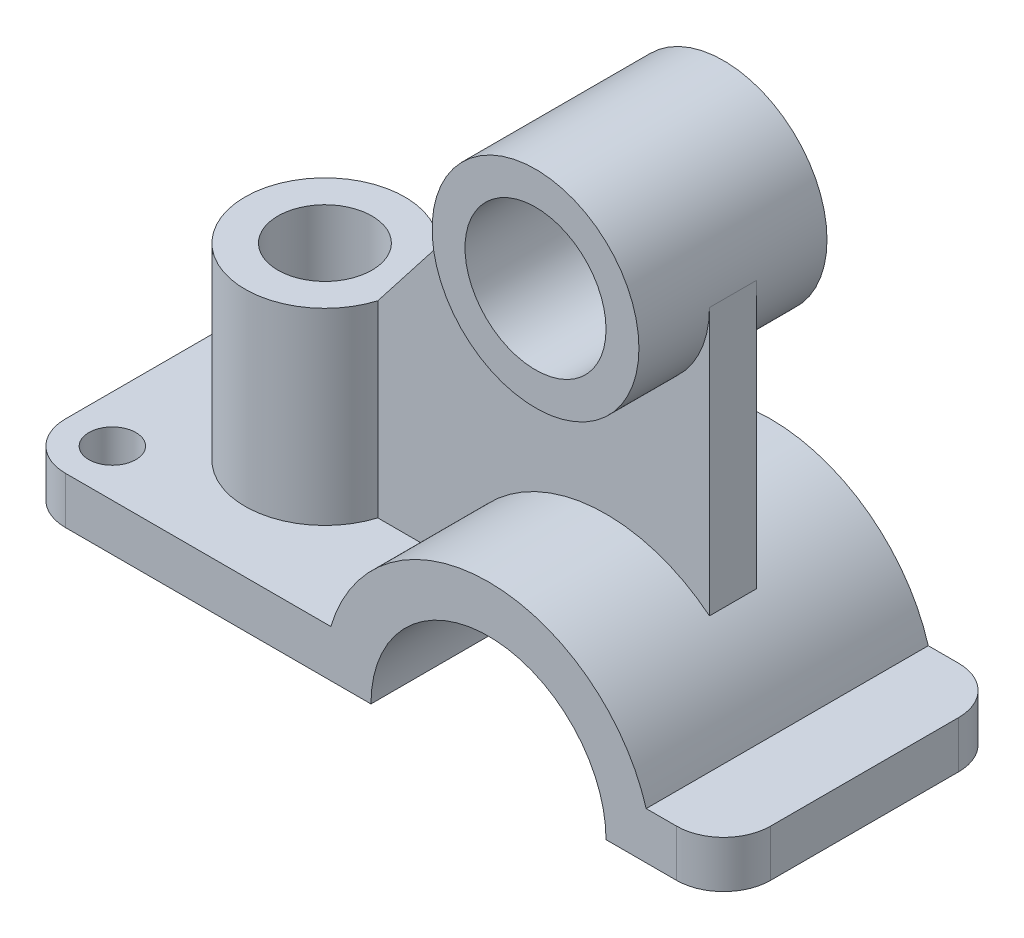
ISO-10303-21;
HEADER;
FILE_DESCRIPTION(('STEP AP214'),'2;1');
FILE_NAME('part.step','',(''),(''),'','','');
FILE_SCHEMA(('AUTOMOTIVE_DESIGN { 1 0 10303 214 1 1 1 1 }'));
ENDSEC;
DATA;
#1=APPLICATION_CONTEXT('core data for automotive mechanical design processes');
#2=APPLICATION_PROTOCOL_DEFINITION('international standard','automotive_design',2000,#1);
#3=PRODUCT_CONTEXT('',#1,'mechanical');
#4=PRODUCT('Part','Part','',(#3));
#5=PRODUCT_RELATED_PRODUCT_CATEGORY('part','',(#4));
#6=PRODUCT_DEFINITION_FORMATION('','',#4);
#7=PRODUCT_DEFINITION_CONTEXT('part definition',#1,'design');
#8=PRODUCT_DEFINITION('design','',#6,#7);
#9=PRODUCT_DEFINITION_SHAPE('','',#8);
#10=(LENGTH_UNIT() NAMED_UNIT(*) SI_UNIT(.MILLI.,.METRE.));
#11=(NAMED_UNIT(*) PLANE_ANGLE_UNIT() SI_UNIT($,.RADIAN.));
#12=(NAMED_UNIT(*) SI_UNIT($,.STERADIAN.) SOLID_ANGLE_UNIT());
#13=UNCERTAINTY_MEASURE_WITH_UNIT(LENGTH_MEASURE(1.E-05),#10,'distance_accuracy_value','');
#14=(GEOMETRIC_REPRESENTATION_CONTEXT(3) GLOBAL_UNCERTAINTY_ASSIGNED_CONTEXT((#13)) GLOBAL_UNIT_ASSIGNED_CONTEXT((#10,
#11,#12)) REPRESENTATION_CONTEXT('',''));
#15=CARTESIAN_POINT('',(0.,0.,0.));
#16=DIRECTION('',(0.,0.,1.));
#17=DIRECTION('',(1.,0.,0.));
#18=AXIS2_PLACEMENT_3D('',#15,#16,#17);
#19=CARTESIAN_POINT('',(0.,168.052354843376,40.));
#20=DIRECTION('',(0.,0.,-1.));
#21=DIRECTION('',(-1.,0.,0.));
#22=AXIS2_PLACEMENT_3D('',#19,#20,#21);
#23=CYLINDRICAL_SURFACE('',#22,30.);
#24=CARTESIAN_POINT('',(0.,168.052354843376,40.));
#25=DIRECTION('',(0.,0.,1.));
#26=DIRECTION('',(1.,0.,0.));
#27=AXIS2_PLACEMENT_3D('',#24,#25,#26);
#28=CIRCLE('',#27,30.);
#29=CARTESIAN_POINT('',(30.,168.052354843376,40.));
#30=VERTEX_POINT('',#29);
#31=EDGE_CURVE('E83',#30,#30,#28,.T.);
#32=ORIENTED_EDGE('',*,*,#31,.T.);
#33=EDGE_LOOP('',(#32));
#34=FACE_BOUND('',#33,.T.);
#35=CARTESIAN_POINT('',(0.,168.052354843376,-40.));
#36=DIRECTION('',(0.,0.,1.));
#37=DIRECTION('',(1.,0.,0.));
#38=AXIS2_PLACEMENT_3D('',#35,#36,#37);
#39=CIRCLE('',#38,30.);
#40=CARTESIAN_POINT('',(30.,168.052354843376,-40.));
#41=VERTEX_POINT('',#40);
#42=EDGE_CURVE('E262',#41,#41,#39,.T.);
#43=ORIENTED_EDGE('',*,*,#42,.F.);
#44=EDGE_LOOP('',(#43));
#45=FACE_BOUND('',#44,.T.);
#46=ADVANCED_FACE('F74',(#34,#45),#23,.F.);
#47=CARTESIAN_POINT('',(0.,168.052354843376,40.));
#48=DIRECTION('',(0.,0.,-1.));
#49=DIRECTION('',(-1.,0.,0.));
#50=AXIS2_PLACEMENT_3D('',#47,#48,#49);
#51=CYLINDRICAL_SURFACE('',#50,44.);
#52=DIRECTION('',(0.,0.,-1.));
#53=VECTOR('',#52,1.);
#54=CARTESIAN_POINT('',(-44.,168.052354843376,9.99999999999999));
#55=LINE('',#54,#53);
#56=CARTESIAN_POINT('',(-44.,168.052354843376,9.99999999999999));
#57=VERTEX_POINT('',#56);
#58=CARTESIAN_POINT('',(-44.,168.052354843376,-9.99999999999999));
#59=VERTEX_POINT('',#58);
#60=EDGE_CURVE('E91',#57,#59,#55,.T.);
#61=ORIENTED_EDGE('',*,*,#60,.F.);
#62=CARTESIAN_POINT('',(0.,168.052354843376,9.99999999999999));
#63=DIRECTION('',(0.,0.,1.));
#64=DIRECTION('',(1.,0.,0.));
#65=AXIS2_PLACEMENT_3D('',#62,#63,#64);
#66=CIRCLE('',#65,44.);
#67=CARTESIAN_POINT('',(44.,168.052354843376,9.99999999999999));
#68=VERTEX_POINT('',#67);
#69=EDGE_CURVE('E95',#57,#68,#66,.T.);
#70=ORIENTED_EDGE('',*,*,#69,.T.);
#71=DIRECTION('',(0.,0.,-1.));
#72=VECTOR('',#71,1.);
#73=CARTESIAN_POINT('',(44.,168.052354843376,9.99999999999999));
#74=LINE('',#73,#72);
#75=CARTESIAN_POINT('',(44.,168.052354843376,-9.99999999999999));
#76=VERTEX_POINT('',#75);
#77=EDGE_CURVE('E241',#68,#76,#74,.T.);
#78=ORIENTED_EDGE('',*,*,#77,.T.);
#79=CARTESIAN_POINT('',(0.,168.052354843376,-9.99999999999999));
#80=DIRECTION('',(0.,0.,1.));
#81=DIRECTION('',(1.,0.,0.));
#82=AXIS2_PLACEMENT_3D('',#79,#80,#81);
#83=CIRCLE('',#82,44.);
#84=EDGE_CURVE('E242',#59,#76,#83,.T.);
#85=ORIENTED_EDGE('',*,*,#84,.F.);
#86=EDGE_LOOP('',(#61,#70,#78,#85));
#87=FACE_BOUND('',#86,.T.);
#88=CARTESIAN_POINT('',(0.,168.052354843376,40.));
#89=DIRECTION('',(0.,0.,1.));
#90=DIRECTION('',(1.,0.,0.));
#91=AXIS2_PLACEMENT_3D('',#88,#89,#90);
#92=CIRCLE('',#91,44.);
#93=CARTESIAN_POINT('',(44.,168.052354843376,40.));
#94=VERTEX_POINT('',#93);
#95=EDGE_CURVE('E13',#94,#94,#92,.T.);
#96=ORIENTED_EDGE('',*,*,#95,.F.);
#97=EDGE_LOOP('',(#96));
#98=FACE_BOUND('',#97,.T.);
#99=CARTESIAN_POINT('',(0.,168.052354843376,-40.));
#100=DIRECTION('',(0.,0.,1.));
#101=DIRECTION('',(1.,0.,0.));
#102=AXIS2_PLACEMENT_3D('',#99,#100,#101);
#103=CIRCLE('',#102,44.);
#104=CARTESIAN_POINT('',(44.,168.052354843376,-40.));
#105=VERTEX_POINT('',#104);
#106=EDGE_CURVE('E77',#105,#105,#103,.T.);
#107=ORIENTED_EDGE('',*,*,#106,.T.);
#108=EDGE_LOOP('',(#107));
#109=FACE_BOUND('',#108,.T.);
#110=ADVANCED_FACE('F271',(#87,#98,#109),#51,.T.);
#111=CARTESIAN_POINT('',(0.,0.,40.));
#112=DIRECTION('',(0.,0.,1.));
#113=DIRECTION('',(1.,0.,0.));
#114=AXIS2_PLACEMENT_3D('',#111,#112,#113);
#115=PLANE('',#114);
#116=ORIENTED_EDGE('',*,*,#31,.F.);
#117=EDGE_LOOP('',(#116));
#118=FACE_BOUND('',#117,.T.);
#119=ORIENTED_EDGE('',*,*,#95,.T.);
#120=EDGE_LOOP('',(#119));
#121=FACE_BOUND('',#120,.T.);
#122=ADVANCED_FACE('F275',(#118,#121),#115,.T.);
#123=CARTESIAN_POINT('',(0.,0.,-40.));
#124=DIRECTION('',(0.,0.,1.));
#125=DIRECTION('',(1.,0.,0.));
#126=AXIS2_PLACEMENT_3D('',#123,#124,#125);
#127=PLANE('',#126);
#128=ORIENTED_EDGE('',*,*,#42,.T.);
#129=EDGE_LOOP('',(#128));
#130=FACE_BOUND('',#129,.T.);
#131=ORIENTED_EDGE('',*,*,#106,.F.);
#132=EDGE_LOOP('',(#131));
#133=FACE_BOUND('',#132,.T.);
#134=ADVANCED_FACE('F273',(#130,#133),#127,.F.);
#135=CARTESIAN_POINT('',(-108.854019923227,84.9080590898827,9.99999999999999));
#136=DIRECTION('',(-0.788495548895208,0.61504046157342,0.));
#137=DIRECTION('',(-0.61504046157342,-0.788495548895208,0.));
#138=AXIS2_PLACEMENT_3D('',#135,#136,#137);
#139=PLANE('',#138);
#140=DIRECTION('',(0.61504046157342,0.788495548895208,0.));
#141=VECTOR('',#140,1.);
#142=CARTESIAN_POINT('',(-108.854019923227,84.9080590898827,-9.99999999999999));
#143=LINE('',#142,#141);
#144=CARTESIAN_POINT('',(-97.082039325,99.9999999999763,-9.99999999999999));
#145=VERTEX_POINT('',#144);
#146=EDGE_CURVE('E223',#145,#59,#143,.T.);
#147=ORIENTED_EDGE('',*,*,#146,.F.);
#148=DIRECTION('',(0.,0.,-1.));
#149=VECTOR('',#148,1.);
#150=CARTESIAN_POINT('',(-97.082039325,99.9999999999763,9.99999999999999));
#151=LINE('',#150,#149);
#152=CARTESIAN_POINT('',(-97.082039325,100.,9.99999999999999));
#153=VERTEX_POINT('',#152);
#154=EDGE_CURVE('E202',#153,#145,#151,.T.);
#155=ORIENTED_EDGE('',*,*,#154,.F.);
#156=DIRECTION('',(0.61504046157342,0.788495548895208,0.));
#157=VECTOR('',#156,1.);
#158=CARTESIAN_POINT('',(-108.854019923227,84.9080590898827,9.99999999999999));
#159=LINE('',#158,#157);
#160=EDGE_CURVE('E217',#153,#57,#159,.T.);
#161=ORIENTED_EDGE('',*,*,#160,.T.);
#162=ORIENTED_EDGE('',*,*,#60,.T.);
#163=EDGE_LOOP('',(#147,#155,#161,#162));
#164=FACE_BOUND('',#163,.T.);
#165=ADVANCED_FACE('F221',(#164),#139,.T.);
#166=CARTESIAN_POINT('',(44.,0.,9.99999999999999));
#167=DIRECTION('',(1.,0.,0.));
#168=DIRECTION('',(0.,0.,-1.));
#169=AXIS2_PLACEMENT_3D('',#166,#167,#168);
#170=PLANE('',#169);
#171=DIRECTION('',(0.,-1.,0.));
#172=VECTOR('',#171,1.);
#173=CARTESIAN_POINT('',(44.,0.,-9.99999999999999));
#174=LINE('',#173,#172);
#175=CARTESIAN_POINT('',(44.,54.4426303552649,-9.99999999999999));
#176=VERTEX_POINT('',#175);
#177=EDGE_CURVE('E231',#76,#176,#174,.T.);
#178=ORIENTED_EDGE('',*,*,#177,.F.);
#179=ORIENTED_EDGE('',*,*,#77,.F.);
#180=DIRECTION('',(0.,-1.,0.));
#181=VECTOR('',#180,1.);
#182=CARTESIAN_POINT('',(44.,0.,9.99999999999999));
#183=LINE('',#182,#181);
#184=CARTESIAN_POINT('',(44.,54.4426303552649,9.99999999999999));
#185=VERTEX_POINT('',#184);
#186=EDGE_CURVE('E238',#68,#185,#183,.T.);
#187=ORIENTED_EDGE('',*,*,#186,.T.);
#188=DIRECTION('',(0.,0.,-1.));
#189=VECTOR('',#188,1.);
#190=CARTESIAN_POINT('',(44.,54.4426303553763,9.99999999999999));
#191=LINE('',#190,#189);
#192=EDGE_CURVE('E225',#185,#176,#191,.T.);
#193=ORIENTED_EDGE('',*,*,#192,.T.);
#194=EDGE_LOOP('',(#178,#179,#187,#193));
#195=FACE_BOUND('',#194,.T.);
#196=ADVANCED_FACE('F281',(#195),#170,.T.);
#197=CARTESIAN_POINT('',(0.,0.,9.99999999999999));
#198=DIRECTION('',(0.,0.,1.));
#199=DIRECTION('',(1.,0.,0.));
#200=AXIS2_PLACEMENT_3D('',#197,#198,#199);
#201=PLANE('',#200);
#202=ORIENTED_EDGE('',*,*,#69,.F.);
#203=ORIENTED_EDGE('',*,*,#160,.F.);
#204=DIRECTION('',(0.,1.,0.));
#205=VECTOR('',#204,1.);
#206=CARTESIAN_POINT('',(-97.082039325,0.,9.99999999999999));
#207=LINE('',#206,#205);
#208=CARTESIAN_POINT('',(-97.082039325,19.9999999999763,9.99999999999999));
#209=VERTEX_POINT('',#208);
#210=EDGE_CURVE('E211',#209,#153,#207,.T.);
#211=ORIENTED_EDGE('',*,*,#210,.F.);
#212=DIRECTION('',(-1.,0.,0.));
#213=VECTOR('',#212,1.);
#214=CARTESIAN_POINT('',(0.,19.9999999999763,9.99999999999999));
#215=LINE('',#214,#213);
#216=CARTESIAN_POINT('',(-67.0820393250008,19.9999999999763,9.99999999999999));
#217=VERTEX_POINT('',#216);
#218=EDGE_CURVE('E216',#217,#209,#215,.T.);
#219=ORIENTED_EDGE('',*,*,#218,.F.);
#220=CARTESIAN_POINT('',(0.,0.,9.99999999999999));
#221=DIRECTION('',(0.,0.,1.));
#222=DIRECTION('',(1.,0.,0.));
#223=AXIS2_PLACEMENT_3D('',#220,#221,#222);
#224=CIRCLE('',#223,70.0000000000001);
#225=EDGE_CURVE('E236',#185,#217,#224,.T.);
#226=ORIENTED_EDGE('',*,*,#225,.F.);
#227=ORIENTED_EDGE('',*,*,#186,.F.);
#228=EDGE_LOOP('',(#202,#203,#211,#219,#226,#227));
#229=FACE_BOUND('',#228,.T.);
#230=ADVANCED_FACE('F227',(#229),#201,.T.);
#231=CARTESIAN_POINT('',(0.,0.,-9.99999999999999));
#232=DIRECTION('',(0.,0.,1.));
#233=DIRECTION('',(1.,0.,0.));
#234=AXIS2_PLACEMENT_3D('',#231,#232,#233);
#235=PLANE('',#234);
#236=ORIENTED_EDGE('',*,*,#84,.T.);
#237=ORIENTED_EDGE('',*,*,#177,.T.);
#238=CARTESIAN_POINT('',(0.,0.,-9.99999999999999));
#239=DIRECTION('',(0.,0.,1.));
#240=DIRECTION('',(1.,0.,0.));
#241=AXIS2_PLACEMENT_3D('',#238,#239,#240);
#242=CIRCLE('',#241,70.0000000000001);
#243=CARTESIAN_POINT('',(-67.0820393250008,19.9999999999763,-9.99999999999999));
#244=VERTEX_POINT('',#243);
#245=EDGE_CURVE('E253',#176,#244,#242,.T.);
#246=ORIENTED_EDGE('',*,*,#245,.T.);
#247=DIRECTION('',(-1.,0.,0.));
#248=VECTOR('',#247,1.);
#249=CARTESIAN_POINT('',(0.,19.9999999999763,-9.99999999999999));
#250=LINE('',#249,#248);
#251=CARTESIAN_POINT('',(-97.082039325,19.9999999999763,-10.));
#252=VERTEX_POINT('',#251);
#253=EDGE_CURVE('E250',#244,#252,#250,.T.);
#254=ORIENTED_EDGE('',*,*,#253,.T.);
#255=DIRECTION('',(0.,1.,0.));
#256=VECTOR('',#255,1.);
#257=CARTESIAN_POINT('',(-97.082039325,0.,-9.99999999999999));
#258=LINE('',#257,#256);
#259=EDGE_CURVE('E248',#252,#145,#258,.T.);
#260=ORIENTED_EDGE('',*,*,#259,.T.);
#261=ORIENTED_EDGE('',*,*,#146,.T.);
#262=EDGE_LOOP('',(#236,#237,#246,#254,#260,#261));
#263=FACE_BOUND('',#262,.T.);
#264=ADVANCED_FACE('F304',(#263),#235,.F.);
#265=CARTESIAN_POINT('',(100.,0.,60.));
#266=DIRECTION('',(1.,0.,0.));
#267=DIRECTION('',(0.,0.,-1.));
#268=AXIS2_PLACEMENT_3D('',#265,#266,#267);
#269=PLANE('',#268);
#270=DIRECTION('',(0.,-1.,0.));
#271=VECTOR('',#270,1.);
#272=CARTESIAN_POINT('',(100.,120.,40.));
#273=LINE('',#272,#271);
#274=CARTESIAN_POINT('',(100.,19.9999999999763,40.));
#275=VERTEX_POINT('',#274);
#276=CARTESIAN_POINT('',(100.,0.,40.));
#277=VERTEX_POINT('',#276);
#278=EDGE_CURVE('E557',#275,#277,#273,.T.);
#279=ORIENTED_EDGE('',*,*,#278,.T.);
#280=DIRECTION('',(0.,0.,-1.));
#281=VECTOR('',#280,1.);
#282=CARTESIAN_POINT('',(100.,0.,60.));
#283=LINE('',#282,#281);
#284=CARTESIAN_POINT('',(100.,0.,-40.));
#285=VERTEX_POINT('',#284);
#286=EDGE_CURVE('E637',#277,#285,#283,.T.);
#287=ORIENTED_EDGE('',*,*,#286,.T.);
#288=DIRECTION('',(0.,-1.,0.));
#289=VECTOR('',#288,1.);
#290=CARTESIAN_POINT('',(100.,120.,-40.));
#291=LINE('',#290,#289);
#292=CARTESIAN_POINT('',(100.,19.9999999999763,-40.));
#293=VERTEX_POINT('',#292);
#294=EDGE_CURVE('E555',#293,#285,#291,.T.);
#295=ORIENTED_EDGE('',*,*,#294,.F.);
#296=DIRECTION('',(0.,0.,-1.));
#297=VECTOR('',#296,1.);
#298=CARTESIAN_POINT('',(100.,19.9999999999763,60.));
#299=LINE('',#298,#297);
#300=EDGE_CURVE('E634',#275,#293,#299,.T.);
#301=ORIENTED_EDGE('',*,*,#300,.F.);
#302=EDGE_LOOP('',(#279,#287,#295,#301));
#303=FACE_BOUND('',#302,.T.);
#304=ADVANCED_FACE('F308',(#303),#269,.T.);
#305=CARTESIAN_POINT('',(0.,19.9999999999763,60.));
#306=DIRECTION('',(0.,-1.,0.));
#307=DIRECTION('',(0.,0.,-1.));
#308=AXIS2_PLACEMENT_3D('',#305,#306,#307);
#309=PLANE('',#308);
#310=ORIENTED_EDGE('',*,*,#218,.T.);
#311=CARTESIAN_POINT('',(-129.5781929436,19.9999999999763,0.));
#312=DIRECTION('',(0.,-1.,0.));
#313=DIRECTION('',(0.,0.,-1.));
#314=AXIS2_PLACEMENT_3D('',#311,#312,#313);
#315=CIRCLE('',#314,34.0000000000537);
#316=EDGE_CURVE('E206',#252,#209,#315,.F.);
#317=ORIENTED_EDGE('',*,*,#316,.F.);
#318=ORIENTED_EDGE('',*,*,#253,.F.);
#319=DIRECTION('',(0.,0.,-1.));
#320=VECTOR('',#319,1.);
#321=CARTESIAN_POINT('',(-67.0820393250008,19.9999999999763,60.));
#322=LINE('',#321,#320);
#323=CARTESIAN_POINT('',(-67.0820393250008,19.9999999999763,-60.));
#324=VERTEX_POINT('',#323);
#325=EDGE_CURVE('E628',#244,#324,#322,.T.);
#326=ORIENTED_EDGE('',*,*,#325,.T.);
#327=DIRECTION('',(-1.,0.,0.));
#328=VECTOR('',#327,1.);
#329=CARTESIAN_POINT('',(0.,19.9999999999763,-60.));
#330=LINE('',#329,#328);
#331=CARTESIAN_POINT('',(-180.,19.9999999999763,-60.));
#332=VERTEX_POINT('',#331);
#333=EDGE_CURVE('E616',#324,#332,#330,.T.);
#334=ORIENTED_EDGE('',*,*,#333,.T.);
#335=CARTESIAN_POINT('',(-180.,19.9999999999763,-40.));
#336=DIRECTION('',(0.,-1.,0.));
#337=DIRECTION('',(0.,0.,-1.));
#338=AXIS2_PLACEMENT_3D('',#335,#336,#337);
#339=CIRCLE('',#338,20.);
#340=CARTESIAN_POINT('',(-200.,19.9999999999763,-40.));
#341=VERTEX_POINT('',#340);
#342=EDGE_CURVE('E560',#332,#341,#339,.F.);
#343=ORIENTED_EDGE('',*,*,#342,.T.);
#344=DIRECTION('',(0.,0.,-1.));
#345=VECTOR('',#344,1.);
#346=CARTESIAN_POINT('',(-200.,19.9999999999763,60.));
#347=LINE('',#346,#345);
#348=CARTESIAN_POINT('',(-200.,19.9999999999763,40.));
#349=VERTEX_POINT('',#348);
#350=EDGE_CURVE('E625',#349,#341,#347,.T.);
#351=ORIENTED_EDGE('',*,*,#350,.F.);
#352=CARTESIAN_POINT('',(-180.,19.9999999999763,40.));
#353=DIRECTION('',(0.,-1.,0.));
#354=DIRECTION('',(0.,0.,-1.));
#355=AXIS2_PLACEMENT_3D('',#352,#353,#354);
#356=CIRCLE('',#355,20.);
#357=CARTESIAN_POINT('',(-180.,19.9999999999763,60.));
#358=VERTEX_POINT('',#357);
#359=EDGE_CURVE('E565',#349,#358,#356,.F.);
#360=ORIENTED_EDGE('',*,*,#359,.T.);
#361=DIRECTION('',(-1.,0.,0.));
#362=VECTOR('',#361,1.);
#363=CARTESIAN_POINT('',(0.,19.9999999999763,60.));
#364=LINE('',#363,#362);
#365=CARTESIAN_POINT('',(-67.0820393250008,19.9999999999763,60.));
#366=VERTEX_POINT('',#365);
#367=EDGE_CURVE('E598',#366,#358,#364,.T.);
#368=ORIENTED_EDGE('',*,*,#367,.F.);
#369=EDGE_CURVE('E629',#366,#217,#322,.T.);
#370=ORIENTED_EDGE('',*,*,#369,.T.);
#371=EDGE_LOOP('',(#310,#317,#318,#326,#334,#343,#351,#360,#368,#370));
#372=FACE_BOUND('',#371,.T.);
#373=CARTESIAN_POINT('',(-180.,19.9999999999763,-40.));
#374=DIRECTION('',(0.,-1.,0.));
#375=DIRECTION('',(0.,0.,-1.));
#376=AXIS2_PLACEMENT_3D('',#373,#374,#375);
#377=CIRCLE('',#376,10.);
#378=CARTESIAN_POINT('',(-180.,19.9999999999763,-50.));
#379=VERTEX_POINT('',#378);
#380=EDGE_CURVE('E574',#379,#379,#377,.F.);
#381=ORIENTED_EDGE('',*,*,#380,.F.);
#382=EDGE_LOOP('',(#381));
#383=FACE_BOUND('',#382,.T.);
#384=CARTESIAN_POINT('',(-180.,19.9999999999763,40.));
#385=DIRECTION('',(0.,-1.,0.));
#386=DIRECTION('',(0.,0.,-1.));
#387=AXIS2_PLACEMENT_3D('',#384,#385,#386);
#388=CIRCLE('',#387,9.99999999999998);
#389=CARTESIAN_POINT('',(-180.,19.9999999999763,30.));
#390=VERTEX_POINT('',#389);
#391=EDGE_CURVE('E582',#390,#390,#388,.F.);
#392=ORIENTED_EDGE('',*,*,#391,.F.);
#393=EDGE_LOOP('',(#392));
#394=FACE_BOUND('',#393,.T.);
#395=ADVANCED_FACE('F351',(#372,#383,#394),#309,.F.);
#396=CARTESIAN_POINT('',(-200.,0.,60.));
#397=DIRECTION('',(-1.,0.,0.));
#398=DIRECTION('',(0.,0.,1.));
#399=AXIS2_PLACEMENT_3D('',#396,#397,#398);
#400=PLANE('',#399);
#401=DIRECTION('',(0.,-1.,0.));
#402=VECTOR('',#401,1.);
#403=CARTESIAN_POINT('',(-200.,120.,-40.));
#404=LINE('',#403,#402);
#405=CARTESIAN_POINT('',(-200.,0.,-40.));
#406=VERTEX_POINT('',#405);
#407=EDGE_CURVE('E552',#341,#406,#404,.T.);
#408=ORIENTED_EDGE('',*,*,#407,.T.);
#409=DIRECTION('',(0.,0.,-1.));
#410=VECTOR('',#409,1.);
#411=CARTESIAN_POINT('',(-200.,-2.36477504245158E-11,60.));
#412=LINE('',#411,#410);
#413=CARTESIAN_POINT('',(-200.,0.,40.));
#414=VERTEX_POINT('',#413);
#415=EDGE_CURVE('E622',#414,#406,#412,.T.);
#416=ORIENTED_EDGE('',*,*,#415,.F.);
#417=DIRECTION('',(0.,-1.,0.));
#418=VECTOR('',#417,1.);
#419=CARTESIAN_POINT('',(-200.,120.,40.));
#420=LINE('',#419,#418);
#421=EDGE_CURVE('E550',#349,#414,#420,.T.);
#422=ORIENTED_EDGE('',*,*,#421,.F.);
#423=ORIENTED_EDGE('',*,*,#350,.T.);
#424=EDGE_LOOP('',(#408,#416,#422,#423));
#425=FACE_BOUND('',#424,.T.);
#426=ADVANCED_FACE('F360',(#425),#400,.T.);
#427=CARTESIAN_POINT('',(0.,-2.36477504245158E-11,60.));
#428=DIRECTION('',(0.,-1.,0.));
#429=DIRECTION('',(0.,0.,-1.));
#430=AXIS2_PLACEMENT_3D('',#427,#428,#429);
#431=PLANE('',#430);
#432=CARTESIAN_POINT('',(-180.,0.,-40.));
#433=DIRECTION('',(0.,1.,0.));
#434=DIRECTION('',(0.,0.,1.));
#435=AXIS2_PLACEMENT_3D('',#432,#433,#434);
#436=CIRCLE('',#435,10.);
#437=CARTESIAN_POINT('',(-180.,0.,-30.));
#438=VERTEX_POINT('',#437);
#439=EDGE_CURVE('E571',#438,#438,#436,.T.);
#440=ORIENTED_EDGE('',*,*,#439,.T.);
#441=EDGE_LOOP('',(#440));
#442=FACE_BOUND('',#441,.T.);
#443=CARTESIAN_POINT('',(-180.,0.,40.));
#444=DIRECTION('',(0.,1.,0.));
#445=DIRECTION('',(0.,0.,1.));
#446=AXIS2_PLACEMENT_3D('',#443,#444,#445);
#447=CIRCLE('',#446,9.99999999999998);
#448=CARTESIAN_POINT('',(-180.,0.,50.));
#449=VERTEX_POINT('',#448);
#450=EDGE_CURVE('E579',#449,#449,#447,.T.);
#451=ORIENTED_EDGE('',*,*,#450,.T.);
#452=EDGE_LOOP('',(#451));
#453=FACE_BOUND('',#452,.T.);
#454=CARTESIAN_POINT('',(-180.,0.,-40.));
#455=DIRECTION('',(0.,1.,0.));
#456=DIRECTION('',(0.,0.,1.));
#457=AXIS2_PLACEMENT_3D('',#454,#455,#456);
#458=CIRCLE('',#457,20.);
#459=CARTESIAN_POINT('',(-180.,0.,-60.));
#460=VERTEX_POINT('',#459);
#461=EDGE_CURVE('E546',#460,#406,#458,.T.);
#462=ORIENTED_EDGE('',*,*,#461,.F.);
#463=DIRECTION('',(-1.,0.,0.));
#464=VECTOR('',#463,1.);
#465=CARTESIAN_POINT('',(0.,-2.36477504245158E-11,-60.));
#466=LINE('',#465,#464);
#467=CARTESIAN_POINT('',(-50.,-2.36477504245158E-11,-60.));
#468=VERTEX_POINT('',#467);
#469=EDGE_CURVE('E590',#468,#460,#466,.T.);
#470=ORIENTED_EDGE('',*,*,#469,.F.);
#471=DIRECTION('',(0.,0.,-1.));
#472=VECTOR('',#471,1.);
#473=CARTESIAN_POINT('',(-50.,-2.36477504245158E-11,60.));
#474=LINE('',#473,#472);
#475=CARTESIAN_POINT('',(-50.,-2.36477504245158E-11,60.));
#476=VERTEX_POINT('',#475);
#477=EDGE_CURVE('E604',#476,#468,#474,.T.);
#478=ORIENTED_EDGE('',*,*,#477,.F.);
#479=DIRECTION('',(-1.,0.,0.));
#480=VECTOR('',#479,1.);
#481=CARTESIAN_POINT('',(0.,-2.36477504245158E-11,60.));
#482=LINE('',#481,#480);
#483=CARTESIAN_POINT('',(-180.,-2.36477504245158E-11,60.));
#484=VERTEX_POINT('',#483);
#485=EDGE_CURVE('E601',#476,#484,#482,.T.);
#486=ORIENTED_EDGE('',*,*,#485,.T.);
#487=CARTESIAN_POINT('',(-180.,0.,40.));
#488=DIRECTION('',(0.,1.,0.));
#489=DIRECTION('',(0.,0.,1.));
#490=AXIS2_PLACEMENT_3D('',#487,#488,#489);
#491=CIRCLE('',#490,20.);
#492=EDGE_CURVE('E548',#414,#484,#491,.T.);
#493=ORIENTED_EDGE('',*,*,#492,.F.);
#494=ORIENTED_EDGE('',*,*,#415,.T.);
#495=EDGE_LOOP('',(#462,#470,#478,#486,#493,#494));
#496=FACE_BOUND('',#495,.T.);
#497=CARTESIAN_POINT('',(-129.5781929436,0.,0.));
#498=DIRECTION('',(0.,1.,0.));
#499=DIRECTION('',(0.,0.,1.));
#500=AXIS2_PLACEMENT_3D('',#497,#498,#499);
#501=CIRCLE('',#500,20.);
#502=CARTESIAN_POINT('',(-129.5781929436,0.,20.));
#503=VERTEX_POINT('',#502);
#504=EDGE_CURVE('E570',#503,#503,#501,.T.);
#505=ORIENTED_EDGE('',*,*,#504,.T.);
#506=EDGE_LOOP('',(#505));
#507=FACE_BOUND('',#506,.T.);
#508=ADVANCED_FACE('F372',(#442,#453,#496,#507),#431,.T.);
#509=CARTESIAN_POINT('',(0.,0.,60.));
#510=DIRECTION('',(0.,0.,1.));
#511=DIRECTION('',(1.,0.,0.));
#512=AXIS2_PLACEMENT_3D('',#509,#510,#511);
#513=PLANE('',#512);
#514=DIRECTION('',(1.,0.,0.));
#515=VECTOR('',#514,1.);
#516=CARTESIAN_POINT('',(0.,0.,60.));
#517=LINE('',#516,#515);
#518=CARTESIAN_POINT('',(50.,0.,60.));
#519=VERTEX_POINT('',#518);
#520=CARTESIAN_POINT('',(80.,0.,60.));
#521=VERTEX_POINT('',#520);
#522=EDGE_CURVE('E589',#519,#521,#517,.T.);
#523=ORIENTED_EDGE('',*,*,#522,.T.);
#524=DIRECTION('',(0.,-1.,0.));
#525=VECTOR('',#524,1.);
#526=CARTESIAN_POINT('',(80.,120.,60.));
#527=LINE('',#526,#525);
#528=CARTESIAN_POINT('',(80.,19.9999999999763,60.));
#529=VERTEX_POINT('',#528);
#530=EDGE_CURVE('E246',#521,#529,#527,.F.);
#531=ORIENTED_EDGE('',*,*,#530,.T.);
#532=DIRECTION('',(1.,0.,0.));
#533=VECTOR('',#532,1.);
#534=CARTESIAN_POINT('',(0.,19.9999999999763,60.));
#535=LINE('',#534,#533);
#536=CARTESIAN_POINT('',(67.0820393250008,19.9999999999763,60.));
#537=VERTEX_POINT('',#536);
#538=EDGE_CURVE('E593',#537,#529,#535,.T.);
#539=ORIENTED_EDGE('',*,*,#538,.F.);
#540=CARTESIAN_POINT('',(0.,0.,60.));
#541=DIRECTION('',(0.,0.,1.));
#542=DIRECTION('',(1.,0.,0.));
#543=AXIS2_PLACEMENT_3D('',#540,#541,#542);
#544=CIRCLE('',#543,70.0000000000001);
#545=EDGE_CURVE('E596',#537,#366,#544,.T.);
#546=ORIENTED_EDGE('',*,*,#545,.T.);
#547=ORIENTED_EDGE('',*,*,#367,.T.);
#548=DIRECTION('',(0.,-1.,0.));
#549=VECTOR('',#548,1.);
#550=CARTESIAN_POINT('',(-180.,120.,60.));
#551=LINE('',#550,#549);
#552=EDGE_CURVE('E647',#484,#358,#551,.F.);
#553=ORIENTED_EDGE('',*,*,#552,.F.);
#554=ORIENTED_EDGE('',*,*,#485,.F.);
#555=CARTESIAN_POINT('',(0.,0.,60.));
#556=DIRECTION('',(0.,0.,1.));
#557=DIRECTION('',(1.,0.,0.));
#558=AXIS2_PLACEMENT_3D('',#555,#556,#557);
#559=CIRCLE('',#558,50.);
#560=EDGE_CURVE('E586',#519,#476,#559,.T.);
#561=ORIENTED_EDGE('',*,*,#560,.F.);
#562=EDGE_LOOP('',(#523,#531,#539,#546,#547,#553,#554,#561));
#563=FACE_BOUND('',#562,.T.);
#564=ADVANCED_FACE('F382',(#563),#513,.T.);
#565=CARTESIAN_POINT('',(0.,0.,-60.));
#566=DIRECTION('',(0.,0.,1.));
#567=DIRECTION('',(1.,0.,0.));
#568=AXIS2_PLACEMENT_3D('',#565,#566,#567);
#569=PLANE('',#568);
#570=DIRECTION('',(0.,-1.,0.));
#571=VECTOR('',#570,1.);
#572=CARTESIAN_POINT('',(80.,120.,-60.));
#573=LINE('',#572,#571);
#574=CARTESIAN_POINT('',(80.,0.,-60.));
#575=VERTEX_POINT('',#574);
#576=CARTESIAN_POINT('',(80.,19.9999999999763,-60.));
#577=VERTEX_POINT('',#576);
#578=EDGE_CURVE('E645',#575,#577,#573,.F.);
#579=ORIENTED_EDGE('',*,*,#578,.F.);
#580=DIRECTION('',(1.,0.,0.));
#581=VECTOR('',#580,1.);
#582=CARTESIAN_POINT('',(0.,0.,-60.));
#583=LINE('',#582,#581);
#584=CARTESIAN_POINT('',(50.,0.,-60.));
#585=VERTEX_POINT('',#584);
#586=EDGE_CURVE('E607',#585,#575,#583,.T.);
#587=ORIENTED_EDGE('',*,*,#586,.F.);
#588=CARTESIAN_POINT('',(0.,0.,-60.));
#589=DIRECTION('',(0.,0.,1.));
#590=DIRECTION('',(1.,0.,0.));
#591=AXIS2_PLACEMENT_3D('',#588,#589,#590);
#592=CIRCLE('',#591,50.);
#593=EDGE_CURVE('E585',#585,#468,#592,.T.);
#594=ORIENTED_EDGE('',*,*,#593,.T.);
#595=ORIENTED_EDGE('',*,*,#469,.T.);
#596=DIRECTION('',(0.,-1.,0.));
#597=VECTOR('',#596,1.);
#598=CARTESIAN_POINT('',(-180.,120.,-60.));
#599=LINE('',#598,#597);
#600=EDGE_CURVE('E642',#460,#332,#599,.F.);
#601=ORIENTED_EDGE('',*,*,#600,.T.);
#602=ORIENTED_EDGE('',*,*,#333,.F.);
#603=CARTESIAN_POINT('',(0.,0.,-60.));
#604=DIRECTION('',(0.,0.,1.));
#605=DIRECTION('',(1.,0.,0.));
#606=AXIS2_PLACEMENT_3D('',#603,#604,#605);
#607=CIRCLE('',#606,70.0000000000001);
#608=CARTESIAN_POINT('',(67.0820393250008,19.9999999999763,-60.));
#609=VERTEX_POINT('',#608);
#610=EDGE_CURVE('E613',#609,#324,#607,.T.);
#611=ORIENTED_EDGE('',*,*,#610,.F.);
#612=DIRECTION('',(1.,0.,0.));
#613=VECTOR('',#612,1.);
#614=CARTESIAN_POINT('',(0.,19.9999999999763,-60.));
#615=LINE('',#614,#613);
#616=EDGE_CURVE('E610',#609,#577,#615,.T.);
#617=ORIENTED_EDGE('',*,*,#616,.T.);
#618=EDGE_LOOP('',(#579,#587,#594,#595,#601,#602,#611,#617));
#619=FACE_BOUND('',#618,.T.);
#620=ADVANCED_FACE('F393',(#619),#569,.F.);
#621=CARTESIAN_POINT('',(0.,0.,60.));
#622=DIRECTION('',(0.,0.,-1.));
#623=DIRECTION('',(-1.,0.,0.));
#624=AXIS2_PLACEMENT_3D('',#621,#622,#623);
#625=CYLINDRICAL_SURFACE('',#624,50.);
#626=ORIENTED_EDGE('',*,*,#593,.F.);
#627=DIRECTION('',(0.,0.,-1.));
#628=VECTOR('',#627,1.);
#629=CARTESIAN_POINT('',(50.,0.,60.));
#630=LINE('',#629,#628);
#631=EDGE_CURVE('E640',#519,#585,#630,.T.);
#632=ORIENTED_EDGE('',*,*,#631,.F.);
#633=ORIENTED_EDGE('',*,*,#560,.T.);
#634=ORIENTED_EDGE('',*,*,#477,.T.);
#635=EDGE_LOOP('',(#626,#632,#633,#634));
#636=FACE_BOUND('',#635,.T.);
#637=ADVANCED_FACE('F403',(#636),#625,.F.);
#638=CARTESIAN_POINT('',(0.,0.,60.));
#639=DIRECTION('',(0.,1.,0.));
#640=DIRECTION('',(0.,0.,1.));
#641=AXIS2_PLACEMENT_3D('',#638,#639,#640);
#642=PLANE('',#641);
#643=ORIENTED_EDGE('',*,*,#286,.F.);
#644=CARTESIAN_POINT('',(80.,0.,40.));
#645=DIRECTION('',(0.,1.,0.));
#646=DIRECTION('',(0.,0.,1.));
#647=AXIS2_PLACEMENT_3D('',#644,#645,#646);
#648=CIRCLE('',#647,20.);
#649=EDGE_CURVE('E542',#521,#277,#648,.T.);
#650=ORIENTED_EDGE('',*,*,#649,.F.);
#651=ORIENTED_EDGE('',*,*,#522,.F.);
#652=ORIENTED_EDGE('',*,*,#631,.T.);
#653=ORIENTED_EDGE('',*,*,#586,.T.);
#654=CARTESIAN_POINT('',(80.,0.,-40.));
#655=DIRECTION('',(0.,1.,0.));
#656=DIRECTION('',(0.,0.,1.));
#657=AXIS2_PLACEMENT_3D('',#654,#655,#656);
#658=CIRCLE('',#657,20.);
#659=EDGE_CURVE('E544',#285,#575,#658,.T.);
#660=ORIENTED_EDGE('',*,*,#659,.F.);
#661=EDGE_LOOP('',(#643,#650,#651,#652,#653,#660));
#662=FACE_BOUND('',#661,.T.);
#663=ADVANCED_FACE('F413',(#662),#642,.F.);
#664=CARTESIAN_POINT('',(0.,19.9999999999763,60.));
#665=DIRECTION('',(0.,1.,0.));
#666=DIRECTION('',(0.,0.,1.));
#667=AXIS2_PLACEMENT_3D('',#664,#665,#666);
#668=PLANE('',#667);
#669=CARTESIAN_POINT('',(80.,19.9999999999763,40.));
#670=DIRECTION('',(0.,1.,0.));
#671=DIRECTION('',(0.,0.,1.));
#672=AXIS2_PLACEMENT_3D('',#669,#670,#671);
#673=CIRCLE('',#672,20.);
#674=EDGE_CURVE('E568',#275,#529,#673,.F.);
#675=ORIENTED_EDGE('',*,*,#674,.F.);
#676=ORIENTED_EDGE('',*,*,#300,.T.);
#677=CARTESIAN_POINT('',(80.,19.9999999999763,-40.));
#678=DIRECTION('',(0.,1.,0.));
#679=DIRECTION('',(0.,0.,1.));
#680=AXIS2_PLACEMENT_3D('',#677,#678,#679);
#681=CIRCLE('',#680,20.);
#682=EDGE_CURVE('E563',#577,#293,#681,.F.);
#683=ORIENTED_EDGE('',*,*,#682,.F.);
#684=ORIENTED_EDGE('',*,*,#616,.F.);
#685=DIRECTION('',(0.,0.,-1.));
#686=VECTOR('',#685,1.);
#687=CARTESIAN_POINT('',(67.0820393250008,19.9999999999763,60.));
#688=LINE('',#687,#686);
#689=EDGE_CURVE('E632',#537,#609,#688,.T.);
#690=ORIENTED_EDGE('',*,*,#689,.F.);
#691=ORIENTED_EDGE('',*,*,#538,.T.);
#692=EDGE_LOOP('',(#675,#676,#683,#684,#690,#691));
#693=FACE_BOUND('',#692,.T.);
#694=ADVANCED_FACE('F423',(#693),#668,.T.);
#695=CARTESIAN_POINT('',(0.,0.,60.));
#696=DIRECTION('',(0.,0.,-1.));
#697=DIRECTION('',(-1.,0.,0.));
#698=AXIS2_PLACEMENT_3D('',#695,#696,#697);
#699=CYLINDRICAL_SURFACE('',#698,70.0000000000001);
#700=ORIENTED_EDGE('',*,*,#225,.T.);
#701=ORIENTED_EDGE('',*,*,#369,.F.);
#702=ORIENTED_EDGE('',*,*,#545,.F.);
#703=ORIENTED_EDGE('',*,*,#689,.T.);
#704=ORIENTED_EDGE('',*,*,#610,.T.);
#705=ORIENTED_EDGE('',*,*,#325,.F.);
#706=ORIENTED_EDGE('',*,*,#245,.F.);
#707=ORIENTED_EDGE('',*,*,#192,.F.);
#708=EDGE_LOOP('',(#700,#701,#702,#703,#704,#705,#706,#707));
#709=FACE_BOUND('',#708,.T.);
#710=ADVANCED_FACE('F434',(#709),#699,.T.);
#711=CARTESIAN_POINT('',(-180.,120.,40.));
#712=DIRECTION('',(0.,-1.,0.));
#713=DIRECTION('',(0.,0.,-1.));
#714=AXIS2_PLACEMENT_3D('',#711,#712,#713);
#715=CYLINDRICAL_SURFACE('',#714,9.99999999999998);
#716=ORIENTED_EDGE('',*,*,#450,.F.);
#717=EDGE_LOOP('',(#716));
#718=FACE_BOUND('',#717,.T.);
#719=ORIENTED_EDGE('',*,*,#391,.T.);
#720=EDGE_LOOP('',(#719));
#721=FACE_BOUND('',#720,.T.);
#722=ADVANCED_FACE('F445',(#718,#721),#715,.F.);
#723=CARTESIAN_POINT('',(-129.5781929436,120.,0.));
#724=DIRECTION('',(0.,-1.,0.));
#725=DIRECTION('',(0.,0.,-1.));
#726=AXIS2_PLACEMENT_3D('',#723,#724,#725);
#727=CYLINDRICAL_SURFACE('',#726,20.);
#728=ORIENTED_EDGE('',*,*,#504,.F.);
#729=EDGE_LOOP('',(#728));
#730=FACE_BOUND('',#729,.T.);
#731=CARTESIAN_POINT('',(-129.5781929436,100.,0.));
#732=DIRECTION('',(0.,1.,0.));
#733=DIRECTION('',(0.,0.,1.));
#734=AXIS2_PLACEMENT_3D('',#731,#732,#733);
#735=CIRCLE('',#734,20.);
#736=CARTESIAN_POINT('',(-129.5781929436,100.,20.));
#737=VERTEX_POINT('',#736);
#738=EDGE_CURVE('E207',#737,#737,#735,.T.);
#739=ORIENTED_EDGE('',*,*,#738,.T.);
#740=EDGE_LOOP('',(#739));
#741=FACE_BOUND('',#740,.T.);
#742=ADVANCED_FACE('F455',(#730,#741),#727,.F.);
#743=CARTESIAN_POINT('',(-180.,120.,-40.));
#744=DIRECTION('',(0.,-1.,0.));
#745=DIRECTION('',(0.,0.,-1.));
#746=AXIS2_PLACEMENT_3D('',#743,#744,#745);
#747=CYLINDRICAL_SURFACE('',#746,10.);
#748=ORIENTED_EDGE('',*,*,#439,.F.);
#749=EDGE_LOOP('',(#748));
#750=FACE_BOUND('',#749,.T.);
#751=ORIENTED_EDGE('',*,*,#380,.T.);
#752=EDGE_LOOP('',(#751));
#753=FACE_BOUND('',#752,.T.);
#754=ADVANCED_FACE('F465',(#750,#753),#747,.F.);
#755=CARTESIAN_POINT('',(-180.,120.,-40.));
#756=DIRECTION('',(0.,-1.,0.));
#757=DIRECTION('',(0.,0.,-1.));
#758=AXIS2_PLACEMENT_3D('',#755,#756,#757);
#759=CYLINDRICAL_SURFACE('',#758,20.);
#760=ORIENTED_EDGE('',*,*,#600,.F.);
#761=ORIENTED_EDGE('',*,*,#461,.T.);
#762=ORIENTED_EDGE('',*,*,#407,.F.);
#763=ORIENTED_EDGE('',*,*,#342,.F.);
#764=EDGE_LOOP('',(#760,#761,#762,#763));
#765=FACE_BOUND('',#764,.T.);
#766=ADVANCED_FACE('F476',(#765),#759,.T.);
#767=CARTESIAN_POINT('',(80.,120.,-40.));
#768=DIRECTION('',(0.,-1.,0.));
#769=DIRECTION('',(0.,0.,-1.));
#770=AXIS2_PLACEMENT_3D('',#767,#768,#769);
#771=CYLINDRICAL_SURFACE('',#770,20.);
#772=ORIENTED_EDGE('',*,*,#682,.T.);
#773=ORIENTED_EDGE('',*,*,#294,.T.);
#774=ORIENTED_EDGE('',*,*,#659,.T.);
#775=ORIENTED_EDGE('',*,*,#578,.T.);
#776=EDGE_LOOP('',(#772,#773,#774,#775));
#777=FACE_BOUND('',#776,.T.);
#778=ADVANCED_FACE('F486',(#777),#771,.T.);
#779=CARTESIAN_POINT('',(-180.,120.,40.));
#780=DIRECTION('',(0.,-1.,0.));
#781=DIRECTION('',(0.,0.,-1.));
#782=AXIS2_PLACEMENT_3D('',#779,#780,#781);
#783=CYLINDRICAL_SURFACE('',#782,20.);
#784=ORIENTED_EDGE('',*,*,#421,.T.);
#785=ORIENTED_EDGE('',*,*,#492,.T.);
#786=ORIENTED_EDGE('',*,*,#552,.T.);
#787=ORIENTED_EDGE('',*,*,#359,.F.);
#788=EDGE_LOOP('',(#784,#785,#786,#787));
#789=FACE_BOUND('',#788,.T.);
#790=ADVANCED_FACE('F496',(#789),#783,.T.);
#791=CARTESIAN_POINT('',(80.,120.,40.));
#792=DIRECTION('',(0.,-1.,0.));
#793=DIRECTION('',(0.,0.,-1.));
#794=AXIS2_PLACEMENT_3D('',#791,#792,#793);
#795=CYLINDRICAL_SURFACE('',#794,20.);
#796=ORIENTED_EDGE('',*,*,#674,.T.);
#797=ORIENTED_EDGE('',*,*,#530,.F.);
#798=ORIENTED_EDGE('',*,*,#649,.T.);
#799=ORIENTED_EDGE('',*,*,#278,.F.);
#800=EDGE_LOOP('',(#796,#797,#798,#799));
#801=FACE_BOUND('',#800,.T.);
#802=ADVANCED_FACE('F506',(#801),#795,.T.);
#803=CARTESIAN_POINT('',(-129.5781929436,100.,0.));
#804=DIRECTION('',(0.,-1.,0.));
#805=DIRECTION('',(0.,0.,-1.));
#806=AXIS2_PLACEMENT_3D('',#803,#804,#805);
#807=CYLINDRICAL_SURFACE('',#806,34.0000000000537);
#808=ORIENTED_EDGE('',*,*,#259,.F.);
#809=ORIENTED_EDGE('',*,*,#316,.T.);
#810=ORIENTED_EDGE('',*,*,#210,.T.);
#811=CARTESIAN_POINT('',(-129.5781929436,100.,0.));
#812=DIRECTION('',(0.,1.,0.));
#813=DIRECTION('',(0.,0.,1.));
#814=AXIS2_PLACEMENT_3D('',#811,#812,#813);
#815=CIRCLE('',#814,34.0000000000537);
#816=EDGE_CURVE('E198',#145,#153,#815,.T.);
#817=ORIENTED_EDGE('',*,*,#816,.F.);
#818=EDGE_LOOP('',(#808,#809,#810,#817));
#819=FACE_BOUND('',#818,.T.);
#820=ADVANCED_FACE('F212',(#819),#807,.T.);
#821=CARTESIAN_POINT('',(0.,100.,0.));
#822=DIRECTION('',(0.,1.,0.));
#823=DIRECTION('',(0.,0.,1.));
#824=AXIS2_PLACEMENT_3D('',#821,#822,#823);
#825=PLANE('',#824);
#826=ORIENTED_EDGE('',*,*,#738,.F.);
#827=EDGE_LOOP('',(#826));
#828=FACE_BOUND('',#827,.T.);
#829=ORIENTED_EDGE('',*,*,#154,.T.);
#830=ORIENTED_EDGE('',*,*,#816,.T.);
#831=EDGE_LOOP('',(#829,#830));
#832=FACE_BOUND('',#831,.T.);
#833=ADVANCED_FACE('F200',(#828,#832),#825,.T.);
#834=CLOSED_SHELL('',(#46,#110,#122,#134,#165,#196,#230,#264,#304,#395,#426,#508,#564,#620,#637,
#663,#694,#710,#722,#742,#754,#766,#778,#790,#802,#820,#833));
#835=MANIFOLD_SOLID_BREP('B2',#834);
#836=ADVANCED_BREP_SHAPE_REPRESENTATION('',(#18,#835),#14);
#837=SHAPE_DEFINITION_REPRESENTATION(#9,#836);
ENDSEC;
END-ISO-10303-21;
